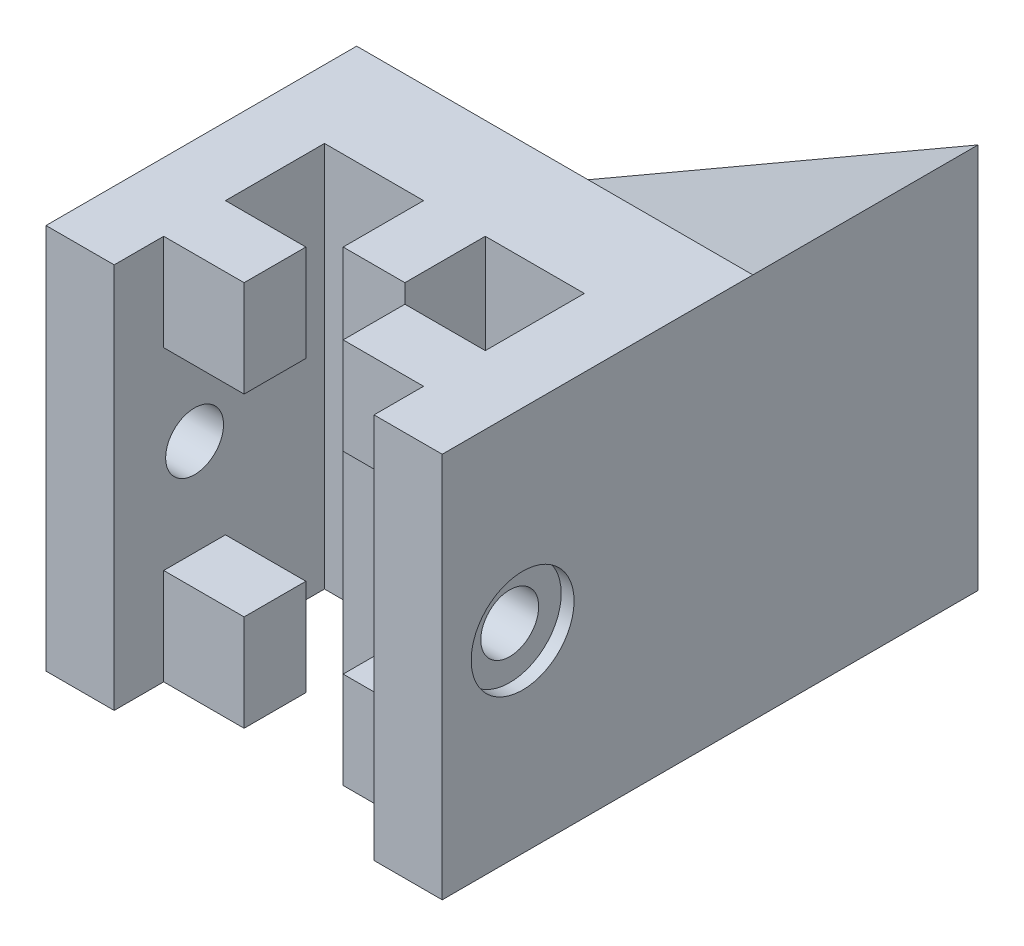
ISO-10303-21;
HEADER;
FILE_DESCRIPTION(('STEP AP214'),'2;1');
FILE_NAME('part.step','',(''),(''),'','','');
FILE_SCHEMA(('AUTOMOTIVE_DESIGN { 1 0 10303 214 1 1 1 1 }'));
ENDSEC;
DATA;
#1=APPLICATION_CONTEXT('core data for automotive mechanical design processes');
#2=APPLICATION_PROTOCOL_DEFINITION('international standard','automotive_design',2000,#1);
#3=PRODUCT_CONTEXT('',#1,'mechanical');
#4=PRODUCT('Part','Part','',(#3));
#5=PRODUCT_RELATED_PRODUCT_CATEGORY('part','',(#4));
#6=PRODUCT_DEFINITION_FORMATION('','',#4);
#7=PRODUCT_DEFINITION_CONTEXT('part definition',#1,'design');
#8=PRODUCT_DEFINITION('design','',#6,#7);
#9=PRODUCT_DEFINITION_SHAPE('','',#8);
#10=(LENGTH_UNIT() NAMED_UNIT(*) SI_UNIT(.MILLI.,.METRE.));
#11=(NAMED_UNIT(*) PLANE_ANGLE_UNIT() SI_UNIT($,.RADIAN.));
#12=(NAMED_UNIT(*) SI_UNIT($,.STERADIAN.) SOLID_ANGLE_UNIT());
#13=UNCERTAINTY_MEASURE_WITH_UNIT(LENGTH_MEASURE(1.E-05),#10,'distance_accuracy_value','');
#14=(GEOMETRIC_REPRESENTATION_CONTEXT(3) GLOBAL_UNCERTAINTY_ASSIGNED_CONTEXT((#13)) GLOBAL_UNIT_ASSIGNED_CONTEXT((#10,
#11,#12)) REPRESENTATION_CONTEXT('',''));
#15=CARTESIAN_POINT('',(0.,0.,0.));
#16=DIRECTION('',(0.,0.,1.));
#17=DIRECTION('',(1.,0.,0.));
#18=AXIS2_PLACEMENT_3D('',#15,#16,#17);
#19=CARTESIAN_POINT('',(-3.85,15.,2.4));
#20=DIRECTION('',(0.,0.,-1.));
#21=DIRECTION('',(-1.,0.,0.));
#22=AXIS2_PLACEMENT_3D('',#19,#20,#21);
#23=PLANE('',#22);
#24=DIRECTION('',(0.,-1.,0.));
#25=VECTOR('',#24,1.);
#26=CARTESIAN_POINT('',(-10.1,15.,2.4));
#27=LINE('',#26,#25);
#28=CARTESIAN_POINT('',(-10.1,15.,2.4));
#29=VERTEX_POINT('',#28);
#30=CARTESIAN_POINT('',(-10.1,7.5,2.4));
#31=VERTEX_POINT('',#30);
#32=EDGE_CURVE('E253',#29,#31,#27,.T.);
#33=ORIENTED_EDGE('',*,*,#32,.T.);
#34=DIRECTION('',(1.,0.,0.));
#35=VECTOR('',#34,1.);
#36=CARTESIAN_POINT('',(-10.1,7.5,2.4));
#37=LINE('',#36,#35);
#38=CARTESIAN_POINT('',(-3.85,7.5,2.4));
#39=VERTEX_POINT('',#38);
#40=EDGE_CURVE('E455',#31,#39,#37,.T.);
#41=ORIENTED_EDGE('',*,*,#40,.T.);
#42=DIRECTION('',(0.,-1.,0.));
#43=VECTOR('',#42,1.);
#44=CARTESIAN_POINT('',(-3.85,15.,2.4));
#45=LINE('',#44,#43);
#46=CARTESIAN_POINT('',(-3.85,15.,2.4));
#47=VERTEX_POINT('',#46);
#48=EDGE_CURVE('E11',#47,#39,#45,.T.);
#49=ORIENTED_EDGE('',*,*,#48,.F.);
#50=DIRECTION('',(1.,0.,0.));
#51=VECTOR('',#50,1.);
#52=CARTESIAN_POINT('',(-3.85,15.,2.4));
#53=LINE('',#52,#51);
#54=EDGE_CURVE('E371',#29,#47,#53,.T.);
#55=ORIENTED_EDGE('',*,*,#54,.F.);
#56=EDGE_LOOP('',(#33,#41,#49,#55));
#57=FACE_BOUND('',#56,.T.);
#58=ADVANCED_FACE('F37',(#57),#23,.F.);
#59=CARTESIAN_POINT('',(-3.85,15.,2.4));
#60=DIRECTION('',(-1.,0.,0.));
#61=DIRECTION('',(0.,0.,1.));
#62=AXIS2_PLACEMENT_3D('',#59,#60,#61);
#63=PLANE('',#62);
#64=ORIENTED_EDGE('',*,*,#48,.T.);
#65=DIRECTION('',(0.,0.,1.));
#66=VECTOR('',#65,1.);
#67=CARTESIAN_POINT('',(-3.85,7.5,2.4));
#68=LINE('',#67,#66);
#69=CARTESIAN_POINT('',(-3.85,7.5,-2.4));
#70=VERTEX_POINT('',#69);
#71=EDGE_CURVE('E240',#70,#39,#68,.T.);
#72=ORIENTED_EDGE('',*,*,#71,.F.);
#73=DIRECTION('',(0.,-1.,0.));
#74=VECTOR('',#73,1.);
#75=CARTESIAN_POINT('',(-3.85,15.,-2.4));
#76=LINE('',#75,#74);
#77=CARTESIAN_POINT('',(-3.85,15.,-2.4));
#78=VERTEX_POINT('',#77);
#79=EDGE_CURVE('E310',#78,#70,#76,.T.);
#80=ORIENTED_EDGE('',*,*,#79,.F.);
#81=DIRECTION('',(0.,0.,-1.));
#82=VECTOR('',#81,1.);
#83=CARTESIAN_POINT('',(-3.85,15.,2.4));
#84=LINE('',#83,#82);
#85=EDGE_CURVE('E373',#47,#78,#84,.T.);
#86=ORIENTED_EDGE('',*,*,#85,.F.);
#87=EDGE_LOOP('',(#64,#72,#80,#86));
#88=FACE_BOUND('',#87,.T.);
#89=ADVANCED_FACE('F535',(#88),#63,.F.);
#90=CARTESIAN_POINT('',(-3.85,15.,-2.4));
#91=DIRECTION('',(0.,0.,1.));
#92=DIRECTION('',(1.,0.,0.));
#93=AXIS2_PLACEMENT_3D('',#90,#91,#92);
#94=PLANE('',#93);
#95=ORIENTED_EDGE('',*,*,#79,.T.);
#96=DIRECTION('',(1.,0.,0.));
#97=VECTOR('',#96,1.);
#98=CARTESIAN_POINT('',(-10.1,7.5,-2.4));
#99=LINE('',#98,#97);
#100=CARTESIAN_POINT('',(-10.1,7.5,-2.4));
#101=VERTEX_POINT('',#100);
#102=EDGE_CURVE('E460',#101,#70,#99,.T.);
#103=ORIENTED_EDGE('',*,*,#102,.F.);
#104=DIRECTION('',(0.,-1.,0.));
#105=VECTOR('',#104,1.);
#106=CARTESIAN_POINT('',(-10.1,15.,-2.4));
#107=LINE('',#106,#105);
#108=CARTESIAN_POINT('',(-10.1,15.,-2.4));
#109=VERTEX_POINT('',#108);
#110=EDGE_CURVE('E308',#109,#101,#107,.T.);
#111=ORIENTED_EDGE('',*,*,#110,.F.);
#112=DIRECTION('',(-1.,0.,0.));
#113=VECTOR('',#112,1.);
#114=CARTESIAN_POINT('',(-3.85,15.,-2.4));
#115=LINE('',#114,#113);
#116=EDGE_CURVE('E378',#78,#109,#115,.T.);
#117=ORIENTED_EDGE('',*,*,#116,.F.);
#118=EDGE_LOOP('',(#95,#103,#111,#117));
#119=FACE_BOUND('',#118,.T.);
#120=ADVANCED_FACE('F541',(#119),#94,.F.);
#121=CARTESIAN_POINT('',(3.85,15.,-2.4));
#122=DIRECTION('',(0.,0.,1.));
#123=DIRECTION('',(1.,0.,0.));
#124=AXIS2_PLACEMENT_3D('',#121,#122,#123);
#125=PLANE('',#124);
#126=DIRECTION('',(0.,-1.,0.));
#127=VECTOR('',#126,1.);
#128=CARTESIAN_POINT('',(10.1,15.,-2.4));
#129=LINE('',#128,#127);
#130=CARTESIAN_POINT('',(10.1,15.,-2.4));
#131=VERTEX_POINT('',#130);
#132=CARTESIAN_POINT('',(10.1,7.5,-2.4));
#133=VERTEX_POINT('',#132);
#134=EDGE_CURVE('E286',#131,#133,#129,.T.);
#135=ORIENTED_EDGE('',*,*,#134,.T.);
#136=DIRECTION('',(-1.,0.,0.));
#137=VECTOR('',#136,1.);
#138=CARTESIAN_POINT('',(10.1,7.5,-2.4));
#139=LINE('',#138,#137);
#140=CARTESIAN_POINT('',(3.85,7.5,-2.4));
#141=VERTEX_POINT('',#140);
#142=EDGE_CURVE('E431',#133,#141,#139,.T.);
#143=ORIENTED_EDGE('',*,*,#142,.T.);
#144=DIRECTION('',(0.,-1.,0.));
#145=VECTOR('',#144,1.);
#146=CARTESIAN_POINT('',(3.85,15.,-2.4));
#147=LINE('',#146,#145);
#148=CARTESIAN_POINT('',(3.85,15.,-2.4));
#149=VERTEX_POINT('',#148);
#150=EDGE_CURVE('E282',#149,#141,#147,.T.);
#151=ORIENTED_EDGE('',*,*,#150,.F.);
#152=DIRECTION('',(-1.,0.,0.));
#153=VECTOR('',#152,1.);
#154=CARTESIAN_POINT('',(3.85,15.,-2.4));
#155=LINE('',#154,#153);
#156=EDGE_CURVE('E399',#131,#149,#155,.T.);
#157=ORIENTED_EDGE('',*,*,#156,.F.);
#158=EDGE_LOOP('',(#135,#143,#151,#157));
#159=FACE_BOUND('',#158,.T.);
#160=ADVANCED_FACE('F578',(#159),#125,.F.);
#161=CARTESIAN_POINT('',(3.85,15.,2.4));
#162=DIRECTION('',(1.,0.,0.));
#163=DIRECTION('',(0.,0.,-1.));
#164=AXIS2_PLACEMENT_3D('',#161,#162,#163);
#165=PLANE('',#164);
#166=ORIENTED_EDGE('',*,*,#150,.T.);
#167=DIRECTION('',(0.,0.,-1.));
#168=VECTOR('',#167,1.);
#169=CARTESIAN_POINT('',(3.85,7.5,-2.4));
#170=LINE('',#169,#168);
#171=CARTESIAN_POINT('',(3.85,7.5,2.4));
#172=VERTEX_POINT('',#171);
#173=EDGE_CURVE('E451',#172,#141,#170,.T.);
#174=ORIENTED_EDGE('',*,*,#173,.F.);
#175=DIRECTION('',(0.,-1.,0.));
#176=VECTOR('',#175,1.);
#177=CARTESIAN_POINT('',(3.85,15.,2.4));
#178=LINE('',#177,#176);
#179=CARTESIAN_POINT('',(3.85,15.,2.4));
#180=VERTEX_POINT('',#179);
#181=EDGE_CURVE('E278',#180,#172,#178,.T.);
#182=ORIENTED_EDGE('',*,*,#181,.F.);
#183=DIRECTION('',(0.,0.,1.));
#184=VECTOR('',#183,1.);
#185=CARTESIAN_POINT('',(3.85,15.,2.4));
#186=LINE('',#185,#184);
#187=EDGE_CURVE('E401',#149,#180,#186,.T.);
#188=ORIENTED_EDGE('',*,*,#187,.F.);
#189=EDGE_LOOP('',(#166,#174,#182,#188));
#190=FACE_BOUND('',#189,.T.);
#191=ADVANCED_FACE('F583',(#190),#165,.F.);
#192=CARTESIAN_POINT('',(3.85,15.,2.4));
#193=DIRECTION('',(0.,0.,-1.));
#194=DIRECTION('',(-1.,0.,0.));
#195=AXIS2_PLACEMENT_3D('',#192,#193,#194);
#196=PLANE('',#195);
#197=ORIENTED_EDGE('',*,*,#181,.T.);
#198=DIRECTION('',(-1.,0.,0.));
#199=VECTOR('',#198,1.);
#200=CARTESIAN_POINT('',(10.1,7.5,2.4));
#201=LINE('',#200,#199);
#202=CARTESIAN_POINT('',(10.1,7.5,2.4));
#203=VERTEX_POINT('',#202);
#204=EDGE_CURVE('E447',#203,#172,#201,.T.);
#205=ORIENTED_EDGE('',*,*,#204,.F.);
#206=DIRECTION('',(0.,-1.,0.));
#207=VECTOR('',#206,1.);
#208=CARTESIAN_POINT('',(10.1,15.,2.4));
#209=LINE('',#208,#207);
#210=CARTESIAN_POINT('',(10.1,15.,2.4));
#211=VERTEX_POINT('',#210);
#212=EDGE_CURVE('E274',#211,#203,#209,.T.);
#213=ORIENTED_EDGE('',*,*,#212,.F.);
#214=DIRECTION('',(1.,0.,0.));
#215=VECTOR('',#214,1.);
#216=CARTESIAN_POINT('',(3.85,15.,2.4));
#217=LINE('',#216,#215);
#218=EDGE_CURVE('E403',#180,#211,#217,.T.);
#219=ORIENTED_EDGE('',*,*,#218,.F.);
#220=EDGE_LOOP('',(#197,#205,#213,#219));
#221=FACE_BOUND('',#220,.T.);
#222=ADVANCED_FACE('F498',(#221),#196,.F.);
#223=CARTESIAN_POINT('',(-15.4,15.,-15.4));
#224=DIRECTION('',(1.,0.,0.));
#225=DIRECTION('',(0.,0.,-1.));
#226=AXIS2_PLACEMENT_3D('',#223,#224,#225);
#227=PLANE('',#226);
#228=CARTESIAN_POINT('',(-15.4,0.,0.));
#229=DIRECTION('',(-1.,0.,0.));
#230=DIRECTION('',(0.,0.,1.));
#231=AXIS2_PLACEMENT_3D('',#228,#229,#230);
#232=CIRCLE('',#231,3.99999999999999);
#233=CARTESIAN_POINT('',(-15.4,0.,3.99999999999999));
#234=VERTEX_POINT('',#233);
#235=EDGE_CURVE('E489',#234,#234,#232,.T.);
#236=ORIENTED_EDGE('',*,*,#235,.F.);
#237=EDGE_LOOP('',(#236));
#238=FACE_BOUND('',#237,.T.);
#239=DIRECTION('',(0.,0.,1.));
#240=VECTOR('',#239,1.);
#241=CARTESIAN_POINT('',(-15.4,-2.78238829104051,-157.476492008178));
#242=LINE('',#241,#240);
#243=CARTESIAN_POINT('',(-15.4,-2.78238829104051,-35.4));
#244=VERTEX_POINT('',#243);
#245=CARTESIAN_POINT('',(-15.4,-2.78238829104051,-17.9));
#246=VERTEX_POINT('',#245);
#247=EDGE_CURVE('E434',#244,#246,#242,.T.);
#248=ORIENTED_EDGE('',*,*,#247,.F.);
#249=DIRECTION('',(0.,1.,0.));
#250=VECTOR('',#249,1.);
#251=CARTESIAN_POINT('',(-15.4,15.,-35.4));
#252=LINE('',#251,#250);
#253=CARTESIAN_POINT('',(-15.4,-15.,-35.4));
#254=VERTEX_POINT('',#253);
#255=EDGE_CURVE('E381',#254,#244,#252,.T.);
#256=ORIENTED_EDGE('',*,*,#255,.F.);
#257=DIRECTION('',(0.,0.,1.));
#258=VECTOR('',#257,1.);
#259=CARTESIAN_POINT('',(-15.4,-15.,-15.4));
#260=LINE('',#259,#258);
#261=CARTESIAN_POINT('',(-15.4,-15.,6.25));
#262=VERTEX_POINT('',#261);
#263=EDGE_CURVE('E366',#254,#262,#260,.T.);
#264=ORIENTED_EDGE('',*,*,#263,.T.);
#265=DIRECTION('',(0.,-1.,0.));
#266=VECTOR('',#265,1.);
#267=CARTESIAN_POINT('',(-15.4,15.,6.25));
#268=LINE('',#267,#266);
#269=CARTESIAN_POINT('',(-15.4,15.,6.25));
#270=VERTEX_POINT('',#269);
#271=EDGE_CURVE('E264',#270,#262,#268,.T.);
#272=ORIENTED_EDGE('',*,*,#271,.F.);
#273=DIRECTION('',(0.,0.,1.));
#274=VECTOR('',#273,1.);
#275=CARTESIAN_POINT('',(-15.4,15.,-15.4));
#276=LINE('',#275,#274);
#277=CARTESIAN_POINT('',(-15.4,15.,-17.9));
#278=VERTEX_POINT('',#277);
#279=EDGE_CURVE('E412',#278,#270,#276,.T.);
#280=ORIENTED_EDGE('',*,*,#279,.F.);
#281=DIRECTION('',(0.,1.,0.));
#282=VECTOR('',#281,1.);
#283=CARTESIAN_POINT('',(-15.4,15.,-17.9));
#284=LINE('',#283,#282);
#285=EDGE_CURVE('E429',#246,#278,#284,.T.);
#286=ORIENTED_EDGE('',*,*,#285,.F.);
#287=EDGE_LOOP('',(#248,#256,#264,#272,#280,#286));
#288=FACE_BOUND('',#287,.T.);
#289=ADVANCED_FACE('F495',(#238,#288),#227,.F.);
#290=CARTESIAN_POINT('',(-3.85,-7.5,2.4));
#291=VERTEX_POINT('',#290);
#292=CARTESIAN_POINT('',(-3.85,-15.,2.4));
#293=VERTEX_POINT('',#292);
#294=EDGE_CURVE('E45',#291,#293,#45,.T.);
#295=ORIENTED_EDGE('',*,*,#294,.F.);
#296=DIRECTION('',(1.,0.,0.));
#297=VECTOR('',#296,1.);
#298=CARTESIAN_POINT('',(-10.1,-7.5,2.4));
#299=LINE('',#298,#297);
#300=CARTESIAN_POINT('',(-10.1,-7.5,2.4));
#301=VERTEX_POINT('',#300);
#302=EDGE_CURVE('E234',#301,#291,#299,.T.);
#303=ORIENTED_EDGE('',*,*,#302,.F.);
#304=CARTESIAN_POINT('',(-10.1,-15.,2.4));
#305=VERTEX_POINT('',#304);
#306=EDGE_CURVE('E245',#301,#305,#27,.T.);
#307=ORIENTED_EDGE('',*,*,#306,.T.);
#308=DIRECTION('',(1.,0.,0.));
#309=VECTOR('',#308,1.);
#310=CARTESIAN_POINT('',(-3.85,-15.,2.4));
#311=LINE('',#310,#309);
#312=EDGE_CURVE('E329',#305,#293,#311,.T.);
#313=ORIENTED_EDGE('',*,*,#312,.T.);
#314=EDGE_LOOP('',(#295,#303,#307,#313));
#315=FACE_BOUND('',#314,.T.);
#316=ADVANCED_FACE('F39',(#315),#23,.F.);
#317=CARTESIAN_POINT('',(-3.85,-7.5,-2.4));
#318=VERTEX_POINT('',#317);
#319=CARTESIAN_POINT('',(-3.85,-15.,-2.4));
#320=VERTEX_POINT('',#319);
#321=EDGE_CURVE('E309',#318,#320,#76,.T.);
#322=ORIENTED_EDGE('',*,*,#321,.F.);
#323=DIRECTION('',(0.,0.,-1.));
#324=VECTOR('',#323,1.);
#325=CARTESIAN_POINT('',(-3.85,-7.5,2.4));
#326=LINE('',#325,#324);
#327=EDGE_CURVE('E465',#291,#318,#326,.T.);
#328=ORIENTED_EDGE('',*,*,#327,.F.);
#329=ORIENTED_EDGE('',*,*,#294,.T.);
#330=DIRECTION('',(0.,0.,-1.));
#331=VECTOR('',#330,1.);
#332=CARTESIAN_POINT('',(-3.85,-15.,2.4));
#333=LINE('',#332,#331);
#334=EDGE_CURVE('E326',#293,#320,#333,.T.);
#335=ORIENTED_EDGE('',*,*,#334,.T.);
#336=EDGE_LOOP('',(#322,#328,#329,#335));
#337=FACE_BOUND('',#336,.T.);
#338=ADVANCED_FACE('F327',(#337),#63,.F.);
#339=CARTESIAN_POINT('',(-10.1,-7.5,-2.4));
#340=VERTEX_POINT('',#339);
#341=CARTESIAN_POINT('',(-10.1,-15.,-2.4));
#342=VERTEX_POINT('',#341);
#343=EDGE_CURVE('E307',#340,#342,#107,.T.);
#344=ORIENTED_EDGE('',*,*,#343,.F.);
#345=DIRECTION('',(1.,0.,0.));
#346=VECTOR('',#345,1.);
#347=CARTESIAN_POINT('',(-10.1,-7.5,-2.4));
#348=LINE('',#347,#346);
#349=EDGE_CURVE('E237',#340,#318,#348,.T.);
#350=ORIENTED_EDGE('',*,*,#349,.T.);
#351=ORIENTED_EDGE('',*,*,#321,.T.);
#352=DIRECTION('',(-1.,0.,0.));
#353=VECTOR('',#352,1.);
#354=CARTESIAN_POINT('',(-3.85,-15.,-2.4));
#355=LINE('',#354,#353);
#356=EDGE_CURVE('E322',#320,#342,#355,.T.);
#357=ORIENTED_EDGE('',*,*,#356,.T.);
#358=EDGE_LOOP('',(#344,#350,#351,#357));
#359=FACE_BOUND('',#358,.T.);
#360=ADVANCED_FACE('F320',(#359),#94,.F.);
#361=CARTESIAN_POINT('',(-10.1,15.,-10.1));
#362=DIRECTION('',(0.,0.,-1.));
#363=DIRECTION('',(-1.,0.,0.));
#364=AXIS2_PLACEMENT_3D('',#361,#362,#363);
#365=PLANE('',#364);
#366=DIRECTION('',(1.,0.,0.));
#367=VECTOR('',#366,1.);
#368=CARTESIAN_POINT('',(-10.1,-15.,-10.1));
#369=LINE('',#368,#367);
#370=CARTESIAN_POINT('',(-10.1,-15.,-10.1));
#371=VERTEX_POINT('',#370);
#372=CARTESIAN_POINT('',(-2.4,-15.,-10.1));
#373=VERTEX_POINT('',#372);
#374=EDGE_CURVE('E335',#371,#373,#369,.T.);
#375=ORIENTED_EDGE('',*,*,#374,.T.);
#376=DIRECTION('',(0.,-1.,0.));
#377=VECTOR('',#376,1.);
#378=CARTESIAN_POINT('',(-2.4,15.,-10.1));
#379=LINE('',#378,#377);
#380=CARTESIAN_POINT('',(-2.4,15.,-10.1));
#381=VERTEX_POINT('',#380);
#382=EDGE_CURVE('E301',#381,#373,#379,.T.);
#383=ORIENTED_EDGE('',*,*,#382,.F.);
#384=DIRECTION('',(1.,0.,0.));
#385=VECTOR('',#384,1.);
#386=CARTESIAN_POINT('',(-10.1,15.,-10.1));
#387=LINE('',#386,#385);
#388=CARTESIAN_POINT('',(-10.1,15.,-10.1));
#389=VERTEX_POINT('',#388);
#390=EDGE_CURVE('E387',#389,#381,#387,.T.);
#391=ORIENTED_EDGE('',*,*,#390,.F.);
#392=DIRECTION('',(0.,-1.,0.));
#393=VECTOR('',#392,1.);
#394=CARTESIAN_POINT('',(-10.1,15.,-10.1));
#395=LINE('',#394,#393);
#396=EDGE_CURVE('E304',#389,#371,#395,.T.);
#397=ORIENTED_EDGE('',*,*,#396,.T.);
#398=EDGE_LOOP('',(#375,#383,#391,#397));
#399=FACE_BOUND('',#398,.T.);
#400=ADVANCED_FACE('F551',(#399),#365,.F.);
#401=CARTESIAN_POINT('',(-2.4,15.,-10.1));
#402=DIRECTION('',(1.,0.,0.));
#403=DIRECTION('',(0.,0.,-1.));
#404=AXIS2_PLACEMENT_3D('',#401,#402,#403);
#405=PLANE('',#404);
#406=DIRECTION('',(0.,0.,1.));
#407=VECTOR('',#406,1.);
#408=CARTESIAN_POINT('',(-2.4,-15.,-10.1));
#409=LINE('',#408,#407);
#410=CARTESIAN_POINT('',(-2.4,-15.,-3.85));
#411=VERTEX_POINT('',#410);
#412=EDGE_CURVE('E340',#373,#411,#409,.T.);
#413=ORIENTED_EDGE('',*,*,#412,.T.);
#414=DIRECTION('',(0.,-1.,0.));
#415=VECTOR('',#414,1.);
#416=CARTESIAN_POINT('',(-2.4,15.,-3.85));
#417=LINE('',#416,#415);
#418=CARTESIAN_POINT('',(-2.4,15.,-3.85));
#419=VERTEX_POINT('',#418);
#420=EDGE_CURVE('E298',#419,#411,#417,.T.);
#421=ORIENTED_EDGE('',*,*,#420,.F.);
#422=DIRECTION('',(0.,0.,1.));
#423=VECTOR('',#422,1.);
#424=CARTESIAN_POINT('',(-2.4,15.,-10.1));
#425=LINE('',#424,#423);
#426=EDGE_CURVE('E389',#381,#419,#425,.T.);
#427=ORIENTED_EDGE('',*,*,#426,.F.);
#428=ORIENTED_EDGE('',*,*,#382,.T.);
#429=EDGE_LOOP('',(#413,#421,#427,#428));
#430=FACE_BOUND('',#429,.T.);
#431=ADVANCED_FACE('F556',(#430),#405,.F.);
#432=CARTESIAN_POINT('',(-2.4,15.,-3.85));
#433=DIRECTION('',(0.,0.,-1.));
#434=DIRECTION('',(-1.,0.,0.));
#435=AXIS2_PLACEMENT_3D('',#432,#433,#434);
#436=PLANE('',#435);
#437=DIRECTION('',(1.,0.,0.));
#438=VECTOR('',#437,1.);
#439=CARTESIAN_POINT('',(-2.4,-15.,-3.85));
#440=LINE('',#439,#438);
#441=CARTESIAN_POINT('',(2.4,-15.,-3.85));
#442=VERTEX_POINT('',#441);
#443=EDGE_CURVE('E342',#411,#442,#440,.T.);
#444=ORIENTED_EDGE('',*,*,#443,.T.);
#445=DIRECTION('',(0.,-1.,0.));
#446=VECTOR('',#445,1.);
#447=CARTESIAN_POINT('',(2.4,15.,-3.85));
#448=LINE('',#447,#446);
#449=CARTESIAN_POINT('',(2.4,15.,-3.85));
#450=VERTEX_POINT('',#449);
#451=EDGE_CURVE('E295',#450,#442,#448,.T.);
#452=ORIENTED_EDGE('',*,*,#451,.F.);
#453=DIRECTION('',(1.,0.,0.));
#454=VECTOR('',#453,1.);
#455=CARTESIAN_POINT('',(-2.4,15.,-3.85));
#456=LINE('',#455,#454);
#457=EDGE_CURVE('E391',#419,#450,#456,.T.);
#458=ORIENTED_EDGE('',*,*,#457,.F.);
#459=ORIENTED_EDGE('',*,*,#420,.T.);
#460=EDGE_LOOP('',(#444,#452,#458,#459));
#461=FACE_BOUND('',#460,.T.);
#462=ADVANCED_FACE('F560',(#461),#436,.F.);
#463=CARTESIAN_POINT('',(2.4,15.,-10.1));
#464=DIRECTION('',(-1.,0.,0.));
#465=DIRECTION('',(0.,0.,1.));
#466=AXIS2_PLACEMENT_3D('',#463,#464,#465);
#467=PLANE('',#466);
#468=DIRECTION('',(0.,0.,-1.));
#469=VECTOR('',#468,1.);
#470=CARTESIAN_POINT('',(2.4,-15.,-10.1));
#471=LINE('',#470,#469);
#472=CARTESIAN_POINT('',(2.4,-15.,-10.1));
#473=VERTEX_POINT('',#472);
#474=EDGE_CURVE('E344',#442,#473,#471,.T.);
#475=ORIENTED_EDGE('',*,*,#474,.T.);
#476=DIRECTION('',(0.,-1.,0.));
#477=VECTOR('',#476,1.);
#478=CARTESIAN_POINT('',(2.4,15.,-10.1));
#479=LINE('',#478,#477);
#480=CARTESIAN_POINT('',(2.4,15.,-10.1));
#481=VERTEX_POINT('',#480);
#482=EDGE_CURVE('E292',#481,#473,#479,.T.);
#483=ORIENTED_EDGE('',*,*,#482,.F.);
#484=DIRECTION('',(0.,0.,-1.));
#485=VECTOR('',#484,1.);
#486=CARTESIAN_POINT('',(2.4,15.,-10.1));
#487=LINE('',#486,#485);
#488=EDGE_CURVE('E393',#450,#481,#487,.T.);
#489=ORIENTED_EDGE('',*,*,#488,.F.);
#490=ORIENTED_EDGE('',*,*,#451,.T.);
#491=EDGE_LOOP('',(#475,#483,#489,#490));
#492=FACE_BOUND('',#491,.T.);
#493=ADVANCED_FACE('F564',(#492),#467,.F.);
#494=CARTESIAN_POINT('',(10.1,15.,-10.1));
#495=DIRECTION('',(0.,0.,-1.));
#496=DIRECTION('',(-1.,0.,0.));
#497=AXIS2_PLACEMENT_3D('',#494,#495,#496);
#498=PLANE('',#497);
#499=DIRECTION('',(1.,0.,0.));
#500=VECTOR('',#499,1.);
#501=CARTESIAN_POINT('',(10.1,-15.,-10.1));
#502=LINE('',#501,#500);
#503=CARTESIAN_POINT('',(10.1,-15.,-10.1));
#504=VERTEX_POINT('',#503);
#505=EDGE_CURVE('E346',#473,#504,#502,.T.);
#506=ORIENTED_EDGE('',*,*,#505,.T.);
#507=DIRECTION('',(0.,-1.,0.));
#508=VECTOR('',#507,1.);
#509=CARTESIAN_POINT('',(10.1,15.,-10.1));
#510=LINE('',#509,#508);
#511=CARTESIAN_POINT('',(10.1,15.,-10.1));
#512=VERTEX_POINT('',#511);
#513=EDGE_CURVE('E289',#512,#504,#510,.T.);
#514=ORIENTED_EDGE('',*,*,#513,.F.);
#515=DIRECTION('',(1.,0.,0.));
#516=VECTOR('',#515,1.);
#517=CARTESIAN_POINT('',(10.1,15.,-10.1));
#518=LINE('',#517,#516);
#519=EDGE_CURVE('E395',#481,#512,#518,.T.);
#520=ORIENTED_EDGE('',*,*,#519,.F.);
#521=ORIENTED_EDGE('',*,*,#482,.T.);
#522=EDGE_LOOP('',(#506,#514,#520,#521));
#523=FACE_BOUND('',#522,.T.);
#524=ADVANCED_FACE('F568',(#523),#498,.F.);
#525=CARTESIAN_POINT('',(3.85,-7.5,-2.4));
#526=VERTEX_POINT('',#525);
#527=CARTESIAN_POINT('',(3.85,-15.,-2.4));
#528=VERTEX_POINT('',#527);
#529=EDGE_CURVE('E281',#526,#528,#147,.T.);
#530=ORIENTED_EDGE('',*,*,#529,.F.);
#531=DIRECTION('',(-1.,0.,0.));
#532=VECTOR('',#531,1.);
#533=CARTESIAN_POINT('',(10.1,-7.5,-2.4));
#534=LINE('',#533,#532);
#535=CARTESIAN_POINT('',(10.1,-7.5,-2.4));
#536=VERTEX_POINT('',#535);
#537=EDGE_CURVE('E441',#536,#526,#534,.T.);
#538=ORIENTED_EDGE('',*,*,#537,.F.);
#539=CARTESIAN_POINT('',(10.1,-15.,-2.4));
#540=VERTEX_POINT('',#539);
#541=EDGE_CURVE('E285',#536,#540,#129,.T.);
#542=ORIENTED_EDGE('',*,*,#541,.T.);
#543=DIRECTION('',(-1.,0.,0.));
#544=VECTOR('',#543,1.);
#545=CARTESIAN_POINT('',(3.85,-15.,-2.4));
#546=LINE('',#545,#544);
#547=EDGE_CURVE('E351',#540,#528,#546,.T.);
#548=ORIENTED_EDGE('',*,*,#547,.T.);
#549=EDGE_LOOP('',(#530,#538,#542,#548));
#550=FACE_BOUND('',#549,.T.);
#551=ADVANCED_FACE('F572',(#550),#125,.F.);
#552=CARTESIAN_POINT('',(3.85,-7.5,2.4));
#553=VERTEX_POINT('',#552);
#554=CARTESIAN_POINT('',(3.85,-15.,2.4));
#555=VERTEX_POINT('',#554);
#556=EDGE_CURVE('E277',#553,#555,#178,.T.);
#557=ORIENTED_EDGE('',*,*,#556,.F.);
#558=DIRECTION('',(0.,0.,1.));
#559=VECTOR('',#558,1.);
#560=CARTESIAN_POINT('',(3.85,-7.5,-2.4));
#561=LINE('',#560,#559);
#562=EDGE_CURVE('E453',#526,#553,#561,.T.);
#563=ORIENTED_EDGE('',*,*,#562,.F.);
#564=ORIENTED_EDGE('',*,*,#529,.T.);
#565=DIRECTION('',(0.,0.,1.));
#566=VECTOR('',#565,1.);
#567=CARTESIAN_POINT('',(3.85,-15.,2.4));
#568=LINE('',#567,#566);
#569=EDGE_CURVE('E354',#528,#555,#568,.T.);
#570=ORIENTED_EDGE('',*,*,#569,.T.);
#571=EDGE_LOOP('',(#557,#563,#564,#570));
#572=FACE_BOUND('',#571,.T.);
#573=ADVANCED_FACE('F576',(#572),#165,.F.);
#574=CARTESIAN_POINT('',(10.1,-7.5,2.4));
#575=VERTEX_POINT('',#574);
#576=CARTESIAN_POINT('',(10.1,-15.,2.4));
#577=VERTEX_POINT('',#576);
#578=EDGE_CURVE('E273',#575,#577,#209,.T.);
#579=ORIENTED_EDGE('',*,*,#578,.F.);
#580=DIRECTION('',(-1.,0.,0.));
#581=VECTOR('',#580,1.);
#582=CARTESIAN_POINT('',(10.1,-7.5,2.4));
#583=LINE('',#582,#581);
#584=EDGE_CURVE('E443',#575,#553,#583,.T.);
#585=ORIENTED_EDGE('',*,*,#584,.T.);
#586=ORIENTED_EDGE('',*,*,#556,.T.);
#587=DIRECTION('',(1.,0.,0.));
#588=VECTOR('',#587,1.);
#589=CARTESIAN_POINT('',(3.85,-15.,2.4));
#590=LINE('',#589,#588);
#591=EDGE_CURVE('E357',#555,#577,#590,.T.);
#592=ORIENTED_EDGE('',*,*,#591,.T.);
#593=EDGE_LOOP('',(#579,#585,#586,#592));
#594=FACE_BOUND('',#593,.T.);
#595=ADVANCED_FACE('F581',(#594),#196,.F.);
#596=CARTESIAN_POINT('',(10.1,15.,2.4));
#597=DIRECTION('',(1.,0.,0.));
#598=DIRECTION('',(0.,0.,-1.));
#599=AXIS2_PLACEMENT_3D('',#596,#597,#598);
#600=PLANE('',#599);
#601=CARTESIAN_POINT('',(10.1,0.,0.));
#602=DIRECTION('',(1.,0.,0.));
#603=DIRECTION('',(0.,0.,-1.));
#604=AXIS2_PLACEMENT_3D('',#601,#602,#603);
#605=CIRCLE('',#604,2.25);
#606=CARTESIAN_POINT('',(10.1,0.,-2.25));
#607=VERTEX_POINT('',#606);
#608=EDGE_CURVE('E467',#607,#607,#605,.T.);
#609=ORIENTED_EDGE('',*,*,#608,.T.);
#610=EDGE_LOOP('',(#609));
#611=FACE_BOUND('',#610,.T.);
#612=DIRECTION('',(0.,0.,1.));
#613=VECTOR('',#612,1.);
#614=CARTESIAN_POINT('',(10.1,-15.,2.4));
#615=LINE('',#614,#613);
#616=CARTESIAN_POINT('',(10.1,-15.,6.25));
#617=VERTEX_POINT('',#616);
#618=EDGE_CURVE('E360',#577,#617,#615,.T.);
#619=ORIENTED_EDGE('',*,*,#618,.T.);
#620=DIRECTION('',(0.,-1.,0.));
#621=VECTOR('',#620,1.);
#622=CARTESIAN_POINT('',(10.1,15.,6.25));
#623=LINE('',#622,#621);
#624=CARTESIAN_POINT('',(10.1,15.,6.25));
#625=VERTEX_POINT('',#624);
#626=EDGE_CURVE('E270',#625,#617,#623,.T.);
#627=ORIENTED_EDGE('',*,*,#626,.F.);
#628=DIRECTION('',(0.,0.,1.));
#629=VECTOR('',#628,1.);
#630=CARTESIAN_POINT('',(10.1,15.,2.4));
#631=LINE('',#630,#629);
#632=EDGE_CURVE('E405',#211,#625,#631,.T.);
#633=ORIENTED_EDGE('',*,*,#632,.F.);
#634=ORIENTED_EDGE('',*,*,#212,.T.);
#635=DIRECTION('',(0.,0.,-1.));
#636=VECTOR('',#635,1.);
#637=CARTESIAN_POINT('',(10.1,7.5,-2.4));
#638=LINE('',#637,#636);
#639=EDGE_CURVE('E444',#203,#133,#638,.T.);
#640=ORIENTED_EDGE('',*,*,#639,.T.);
#641=ORIENTED_EDGE('',*,*,#134,.F.);
#642=DIRECTION('',(0.,0.,1.));
#643=VECTOR('',#642,1.);
#644=CARTESIAN_POINT('',(10.1,15.,-2.4));
#645=LINE('',#644,#643);
#646=EDGE_CURVE('E397',#512,#131,#645,.T.);
#647=ORIENTED_EDGE('',*,*,#646,.F.);
#648=ORIENTED_EDGE('',*,*,#513,.T.);
#649=DIRECTION('',(0.,0.,1.));
#650=VECTOR('',#649,1.);
#651=CARTESIAN_POINT('',(10.1,-15.,-2.4));
#652=LINE('',#651,#650);
#653=EDGE_CURVE('E348',#504,#540,#652,.T.);
#654=ORIENTED_EDGE('',*,*,#653,.T.);
#655=ORIENTED_EDGE('',*,*,#541,.F.);
#656=DIRECTION('',(0.,0.,1.));
#657=VECTOR('',#656,1.);
#658=CARTESIAN_POINT('',(10.1,-7.5,-2.4));
#659=LINE('',#658,#657);
#660=EDGE_CURVE('E60',#536,#575,#659,.T.);
#661=ORIENTED_EDGE('',*,*,#660,.T.);
#662=ORIENTED_EDGE('',*,*,#578,.T.);
#663=EDGE_LOOP('',(#619,#627,#633,#634,#640,#641,#647,#648,#654,#655,#661,#662));
#664=FACE_BOUND('',#663,.T.);
#665=ADVANCED_FACE('F586',(#611,#664),#600,.F.);
#666=CARTESIAN_POINT('',(10.1,15.,6.25));
#667=DIRECTION('',(0.,0.,-1.));
#668=DIRECTION('',(-1.,0.,0.));
#669=AXIS2_PLACEMENT_3D('',#666,#667,#668);
#670=PLANE('',#669);
#671=DIRECTION('',(1.,0.,0.));
#672=VECTOR('',#671,1.);
#673=CARTESIAN_POINT('',(10.1,-15.,6.25));
#674=LINE('',#673,#672);
#675=CARTESIAN_POINT('',(15.4,-15.,6.25));
#676=VERTEX_POINT('',#675);
#677=EDGE_CURVE('E362',#617,#676,#674,.T.);
#678=ORIENTED_EDGE('',*,*,#677,.T.);
#679=DIRECTION('',(0.,-1.,0.));
#680=VECTOR('',#679,1.);
#681=CARTESIAN_POINT('',(15.4,15.,6.25));
#682=LINE('',#681,#680);
#683=CARTESIAN_POINT('',(15.4,15.,6.25));
#684=VERTEX_POINT('',#683);
#685=EDGE_CURVE('E267',#684,#676,#682,.T.);
#686=ORIENTED_EDGE('',*,*,#685,.F.);
#687=DIRECTION('',(1.,0.,0.));
#688=VECTOR('',#687,1.);
#689=CARTESIAN_POINT('',(10.1,15.,6.25));
#690=LINE('',#689,#688);
#691=EDGE_CURVE('E407',#625,#684,#690,.T.);
#692=ORIENTED_EDGE('',*,*,#691,.F.);
#693=ORIENTED_EDGE('',*,*,#626,.T.);
#694=EDGE_LOOP('',(#678,#686,#692,#693));
#695=FACE_BOUND('',#694,.T.);
#696=ADVANCED_FACE('F590',(#695),#670,.F.);
#697=CARTESIAN_POINT('',(15.4,15.,-15.4));
#698=DIRECTION('',(-1.,0.,0.));
#699=DIRECTION('',(0.,0.,1.));
#700=AXIS2_PLACEMENT_3D('',#697,#698,#699);
#701=PLANE('',#700);
#702=CARTESIAN_POINT('',(15.4,0.,0.));
#703=DIRECTION('',(1.,0.,0.));
#704=DIRECTION('',(0.,0.,-1.));
#705=AXIS2_PLACEMENT_3D('',#702,#703,#704);
#706=CIRCLE('',#705,3.99999999999999);
#707=CARTESIAN_POINT('',(15.4,0.,-4.));
#708=VERTEX_POINT('',#707);
#709=EDGE_CURVE('E477',#708,#708,#706,.T.);
#710=ORIENTED_EDGE('',*,*,#709,.F.);
#711=EDGE_LOOP('',(#710));
#712=FACE_BOUND('',#711,.T.);
#713=DIRECTION('',(0.,0.,-1.));
#714=VECTOR('',#713,1.);
#715=CARTESIAN_POINT('',(15.4,-15.,-15.4));
#716=LINE('',#715,#714);
#717=CARTESIAN_POINT('',(15.4,-15.,-35.4));
#718=VERTEX_POINT('',#717);
#719=EDGE_CURVE('E364',#676,#718,#716,.T.);
#720=ORIENTED_EDGE('',*,*,#719,.T.);
#721=DIRECTION('',(0.,-1.,0.));
#722=VECTOR('',#721,1.);
#723=CARTESIAN_POINT('',(15.4,-15.,-35.4));
#724=LINE('',#723,#722);
#725=CARTESIAN_POINT('',(15.4,15.,-35.4));
#726=VERTEX_POINT('',#725);
#727=EDGE_CURVE('E420',#726,#718,#724,.T.);
#728=ORIENTED_EDGE('',*,*,#727,.F.);
#729=DIRECTION('',(0.,0.,1.));
#730=VECTOR('',#729,1.);
#731=CARTESIAN_POINT('',(15.4,15.,-157.476492008178));
#732=LINE('',#731,#730);
#733=CARTESIAN_POINT('',(15.4,15.,-17.9));
#734=VERTEX_POINT('',#733);
#735=EDGE_CURVE('E423',#726,#734,#732,.T.);
#736=ORIENTED_EDGE('',*,*,#735,.T.);
#737=DIRECTION('',(0.,0.,-1.));
#738=VECTOR('',#737,1.);
#739=CARTESIAN_POINT('',(15.4,15.,-15.4));
#740=LINE('',#739,#738);
#741=EDGE_CURVE('E409',#684,#734,#740,.T.);
#742=ORIENTED_EDGE('',*,*,#741,.F.);
#743=ORIENTED_EDGE('',*,*,#685,.T.);
#744=EDGE_LOOP('',(#720,#728,#736,#742,#743));
#745=FACE_BOUND('',#744,.T.);
#746=ADVANCED_FACE('F508',(#712,#745),#701,.F.);
#747=CARTESIAN_POINT('',(-10.1,15.,6.25));
#748=DIRECTION('',(0.,0.,-1.));
#749=DIRECTION('',(-1.,0.,0.));
#750=AXIS2_PLACEMENT_3D('',#747,#748,#749);
#751=PLANE('',#750);
#752=DIRECTION('',(1.,0.,0.));
#753=VECTOR('',#752,1.);
#754=CARTESIAN_POINT('',(-10.1,-15.,6.25));
#755=LINE('',#754,#753);
#756=CARTESIAN_POINT('',(-10.1,-15.,6.25));
#757=VERTEX_POINT('',#756);
#758=EDGE_CURVE('E367',#262,#757,#755,.T.);
#759=ORIENTED_EDGE('',*,*,#758,.T.);
#760=DIRECTION('',(0.,-1.,0.));
#761=VECTOR('',#760,1.);
#762=CARTESIAN_POINT('',(-10.1,15.,6.25));
#763=LINE('',#762,#761);
#764=CARTESIAN_POINT('',(-10.1,15.,6.25));
#765=VERTEX_POINT('',#764);
#766=EDGE_CURVE('E257',#765,#757,#763,.T.);
#767=ORIENTED_EDGE('',*,*,#766,.F.);
#768=DIRECTION('',(1.,0.,0.));
#769=VECTOR('',#768,1.);
#770=CARTESIAN_POINT('',(-10.1,15.,6.25));
#771=LINE('',#770,#769);
#772=EDGE_CURVE('E258',#270,#765,#771,.T.);
#773=ORIENTED_EDGE('',*,*,#772,.F.);
#774=ORIENTED_EDGE('',*,*,#271,.T.);
#775=EDGE_LOOP('',(#759,#767,#773,#774));
#776=FACE_BOUND('',#775,.T.);
#777=ADVANCED_FACE('F515',(#776),#751,.F.);
#778=CARTESIAN_POINT('',(-10.1,15.,2.4));
#779=DIRECTION('',(-1.,0.,0.));
#780=DIRECTION('',(0.,0.,1.));
#781=AXIS2_PLACEMENT_3D('',#778,#779,#780);
#782=PLANE('',#781);
#783=CARTESIAN_POINT('',(-10.1,0.,0.));
#784=DIRECTION('',(-1.,0.,0.));
#785=DIRECTION('',(0.,0.,1.));
#786=AXIS2_PLACEMENT_3D('',#783,#784,#785);
#787=CIRCLE('',#786,2.25000000000001);
#788=CARTESIAN_POINT('',(-10.1,0.,2.25000000000001));
#789=VERTEX_POINT('',#788);
#790=EDGE_CURVE('E480',#789,#789,#787,.T.);
#791=ORIENTED_EDGE('',*,*,#790,.T.);
#792=EDGE_LOOP('',(#791));
#793=FACE_BOUND('',#792,.T.);
#794=DIRECTION('',(0.,0.,-1.));
#795=VECTOR('',#794,1.);
#796=CARTESIAN_POINT('',(-10.1,-15.,2.4));
#797=LINE('',#796,#795);
#798=EDGE_CURVE('E251',#757,#305,#797,.T.);
#799=ORIENTED_EDGE('',*,*,#798,.T.);
#800=ORIENTED_EDGE('',*,*,#306,.F.);
#801=DIRECTION('',(0.,0.,-1.));
#802=VECTOR('',#801,1.);
#803=CARTESIAN_POINT('',(-10.1,-7.5,2.4));
#804=LINE('',#803,#802);
#805=EDGE_CURVE('E231',#301,#340,#804,.T.);
#806=ORIENTED_EDGE('',*,*,#805,.T.);
#807=ORIENTED_EDGE('',*,*,#343,.T.);
#808=DIRECTION('',(0.,0.,-1.));
#809=VECTOR('',#808,1.);
#810=CARTESIAN_POINT('',(-10.1,-15.,-2.4));
#811=LINE('',#810,#809);
#812=EDGE_CURVE('E333',#342,#371,#811,.T.);
#813=ORIENTED_EDGE('',*,*,#812,.T.);
#814=ORIENTED_EDGE('',*,*,#396,.F.);
#815=DIRECTION('',(0.,0.,-1.));
#816=VECTOR('',#815,1.);
#817=CARTESIAN_POINT('',(-10.1,15.,-2.4));
#818=LINE('',#817,#816);
#819=EDGE_CURVE('E385',#109,#389,#818,.T.);
#820=ORIENTED_EDGE('',*,*,#819,.F.);
#821=ORIENTED_EDGE('',*,*,#110,.T.);
#822=DIRECTION('',(0.,0.,1.));
#823=VECTOR('',#822,1.);
#824=CARTESIAN_POINT('',(-10.1,7.5,2.4));
#825=LINE('',#824,#823);
#826=EDGE_CURVE('E52',#101,#31,#825,.T.);
#827=ORIENTED_EDGE('',*,*,#826,.T.);
#828=ORIENTED_EDGE('',*,*,#32,.F.);
#829=DIRECTION('',(0.,0.,-1.));
#830=VECTOR('',#829,1.);
#831=CARTESIAN_POINT('',(-10.1,15.,2.4));
#832=LINE('',#831,#830);
#833=EDGE_CURVE('E254',#765,#29,#832,.T.);
#834=ORIENTED_EDGE('',*,*,#833,.F.);
#835=ORIENTED_EDGE('',*,*,#766,.T.);
#836=EDGE_LOOP('',(#799,#800,#806,#807,#813,#814,#820,#821,#827,#828,#834,#835));
#837=FACE_BOUND('',#836,.T.);
#838=ADVANCED_FACE('F248',(#793,#837),#782,.F.);
#839=CARTESIAN_POINT('',(0.,15.,0.));
#840=DIRECTION('',(0.,1.,0.));
#841=DIRECTION('',(0.,0.,1.));
#842=AXIS2_PLACEMENT_3D('',#839,#840,#841);
#843=PLANE('',#842);
#844=DIRECTION('',(1.,0.,0.));
#845=VECTOR('',#844,1.);
#846=CARTESIAN_POINT('',(15.4,15.,-17.9));
#847=LINE('',#846,#845);
#848=EDGE_CURVE('E426',#278,#734,#847,.T.);
#849=ORIENTED_EDGE('',*,*,#848,.F.);
#850=ORIENTED_EDGE('',*,*,#279,.T.);
#851=ORIENTED_EDGE('',*,*,#772,.T.);
#852=ORIENTED_EDGE('',*,*,#833,.T.);
#853=ORIENTED_EDGE('',*,*,#54,.T.);
#854=ORIENTED_EDGE('',*,*,#85,.T.);
#855=ORIENTED_EDGE('',*,*,#116,.T.);
#856=ORIENTED_EDGE('',*,*,#819,.T.);
#857=ORIENTED_EDGE('',*,*,#390,.T.);
#858=ORIENTED_EDGE('',*,*,#426,.T.);
#859=ORIENTED_EDGE('',*,*,#457,.T.);
#860=ORIENTED_EDGE('',*,*,#488,.T.);
#861=ORIENTED_EDGE('',*,*,#519,.T.);
#862=ORIENTED_EDGE('',*,*,#646,.T.);
#863=ORIENTED_EDGE('',*,*,#156,.T.);
#864=ORIENTED_EDGE('',*,*,#187,.T.);
#865=ORIENTED_EDGE('',*,*,#218,.T.);
#866=ORIENTED_EDGE('',*,*,#632,.T.);
#867=ORIENTED_EDGE('',*,*,#691,.T.);
#868=ORIENTED_EDGE('',*,*,#741,.T.);
#869=EDGE_LOOP('',(#849,#850,#851,#852,#853,#854,#855,#856,#857,#858,#859,#860,#861,#862,#863,
#864,#865,#866,#867,#868));
#870=FACE_BOUND('',#869,.T.);
#871=ADVANCED_FACE('F518',(#870),#843,.T.);
#872=CARTESIAN_POINT('',(0.,-15.,0.));
#873=DIRECTION('',(0.,1.,0.));
#874=DIRECTION('',(0.,0.,1.));
#875=AXIS2_PLACEMENT_3D('',#872,#873,#874);
#876=PLANE('',#875);
#877=ORIENTED_EDGE('',*,*,#312,.F.);
#878=ORIENTED_EDGE('',*,*,#798,.F.);
#879=ORIENTED_EDGE('',*,*,#758,.F.);
#880=ORIENTED_EDGE('',*,*,#263,.F.);
#881=DIRECTION('',(-1.,0.,0.));
#882=VECTOR('',#881,1.);
#883=CARTESIAN_POINT('',(-15.4,-15.,-35.4));
#884=LINE('',#883,#882);
#885=EDGE_CURVE('E415',#718,#254,#884,.T.);
#886=ORIENTED_EDGE('',*,*,#885,.F.);
#887=ORIENTED_EDGE('',*,*,#719,.F.);
#888=ORIENTED_EDGE('',*,*,#677,.F.);
#889=ORIENTED_EDGE('',*,*,#618,.F.);
#890=ORIENTED_EDGE('',*,*,#591,.F.);
#891=ORIENTED_EDGE('',*,*,#569,.F.);
#892=ORIENTED_EDGE('',*,*,#547,.F.);
#893=ORIENTED_EDGE('',*,*,#653,.F.);
#894=ORIENTED_EDGE('',*,*,#505,.F.);
#895=ORIENTED_EDGE('',*,*,#474,.F.);
#896=ORIENTED_EDGE('',*,*,#443,.F.);
#897=ORIENTED_EDGE('',*,*,#412,.F.);
#898=ORIENTED_EDGE('',*,*,#374,.F.);
#899=ORIENTED_EDGE('',*,*,#812,.F.);
#900=ORIENTED_EDGE('',*,*,#356,.F.);
#901=ORIENTED_EDGE('',*,*,#334,.F.);
#902=EDGE_LOOP('',(#877,#878,#879,#880,#886,#887,#888,#889,#890,#891,#892,#893,#894,#895,#896,
#897,#898,#899,#900,#901));
#903=FACE_BOUND('',#902,.T.);
#904=ADVANCED_FACE('F331',(#903),#876,.F.);
#905=CARTESIAN_POINT('',(0.,0.,-35.4));
#906=DIRECTION('',(0.,0.,1.));
#907=DIRECTION('',(1.,0.,0.));
#908=AXIS2_PLACEMENT_3D('',#905,#906,#907);
#909=PLANE('',#908);
#910=ORIENTED_EDGE('',*,*,#255,.T.);
#911=DIRECTION('',(0.866025403784438,0.500000000000001,0.));
#912=VECTOR('',#911,1.);
#913=CARTESIAN_POINT('',(15.4,15.,-35.4));
#914=LINE('',#913,#912);
#915=EDGE_CURVE('E428',#244,#726,#914,.T.);
#916=ORIENTED_EDGE('',*,*,#915,.T.);
#917=ORIENTED_EDGE('',*,*,#727,.T.);
#918=ORIENTED_EDGE('',*,*,#885,.T.);
#919=EDGE_LOOP('',(#910,#916,#917,#918));
#920=FACE_BOUND('',#919,.T.);
#921=ADVANCED_FACE('F506',(#920),#909,.F.);
#922=CARTESIAN_POINT('',(15.4,15.,-157.476492008178));
#923=DIRECTION('',(-0.500000000000001,0.866025403784438,0.));
#924=DIRECTION('',(-0.866025403784438,-0.500000000000001,0.));
#925=AXIS2_PLACEMENT_3D('',#922,#923,#924);
#926=PLANE('',#925);
#927=ORIENTED_EDGE('',*,*,#915,.F.);
#928=ORIENTED_EDGE('',*,*,#247,.T.);
#929=DIRECTION('',(0.866025403784438,0.500000000000001,0.));
#930=VECTOR('',#929,1.);
#931=CARTESIAN_POINT('',(15.4,15.,-17.9));
#932=LINE('',#931,#930);
#933=EDGE_CURVE('E437',#246,#734,#932,.T.);
#934=ORIENTED_EDGE('',*,*,#933,.T.);
#935=ORIENTED_EDGE('',*,*,#735,.F.);
#936=EDGE_LOOP('',(#927,#928,#934,#935));
#937=FACE_BOUND('',#936,.T.);
#938=ADVANCED_FACE('F504',(#937),#926,.T.);
#939=CARTESIAN_POINT('',(0.,0.,-17.9));
#940=DIRECTION('',(0.,0.,1.));
#941=DIRECTION('',(1.,0.,0.));
#942=AXIS2_PLACEMENT_3D('',#939,#940,#941);
#943=PLANE('',#942);
#944=ORIENTED_EDGE('',*,*,#848,.T.);
#945=ORIENTED_EDGE('',*,*,#933,.F.);
#946=ORIENTED_EDGE('',*,*,#285,.T.);
#947=EDGE_LOOP('',(#944,#945,#946));
#948=FACE_BOUND('',#947,.T.);
#949=ADVANCED_FACE('F520',(#948),#943,.F.);
#950=CARTESIAN_POINT('',(10.1,7.5,-2.4));
#951=DIRECTION('',(0.,1.,0.));
#952=DIRECTION('',(0.,0.,1.));
#953=AXIS2_PLACEMENT_3D('',#950,#951,#952);
#954=PLANE('',#953);
#955=ORIENTED_EDGE('',*,*,#173,.T.);
#956=ORIENTED_EDGE('',*,*,#142,.F.);
#957=ORIENTED_EDGE('',*,*,#639,.F.);
#958=ORIENTED_EDGE('',*,*,#204,.T.);
#959=EDGE_LOOP('',(#955,#956,#957,#958));
#960=FACE_BOUND('',#959,.T.);
#961=ADVANCED_FACE('F522',(#960),#954,.F.);
#962=CARTESIAN_POINT('',(10.1,-7.5,-2.4));
#963=DIRECTION('',(0.,-1.,0.));
#964=DIRECTION('',(0.,0.,-1.));
#965=AXIS2_PLACEMENT_3D('',#962,#963,#964);
#966=PLANE('',#965);
#967=ORIENTED_EDGE('',*,*,#562,.T.);
#968=ORIENTED_EDGE('',*,*,#584,.F.);
#969=ORIENTED_EDGE('',*,*,#660,.F.);
#970=ORIENTED_EDGE('',*,*,#537,.T.);
#971=EDGE_LOOP('',(#967,#968,#969,#970));
#972=FACE_BOUND('',#971,.T.);
#973=ADVANCED_FACE('F529',(#972),#966,.F.);
#974=CARTESIAN_POINT('',(-10.1,7.5,2.4));
#975=DIRECTION('',(0.,1.,0.));
#976=DIRECTION('',(0.,0.,1.));
#977=AXIS2_PLACEMENT_3D('',#974,#975,#976);
#978=PLANE('',#977);
#979=ORIENTED_EDGE('',*,*,#71,.T.);
#980=ORIENTED_EDGE('',*,*,#40,.F.);
#981=ORIENTED_EDGE('',*,*,#826,.F.);
#982=ORIENTED_EDGE('',*,*,#102,.T.);
#983=EDGE_LOOP('',(#979,#980,#981,#982));
#984=FACE_BOUND('',#983,.T.);
#985=ADVANCED_FACE('F669',(#984),#978,.F.);
#986=CARTESIAN_POINT('',(-10.1,-7.5,2.4));
#987=DIRECTION('',(0.,-1.,0.));
#988=DIRECTION('',(0.,0.,-1.));
#989=AXIS2_PLACEMENT_3D('',#986,#987,#988);
#990=PLANE('',#989);
#991=ORIENTED_EDGE('',*,*,#327,.T.);
#992=ORIENTED_EDGE('',*,*,#349,.F.);
#993=ORIENTED_EDGE('',*,*,#805,.F.);
#994=ORIENTED_EDGE('',*,*,#302,.T.);
#995=EDGE_LOOP('',(#991,#992,#993,#994));
#996=FACE_BOUND('',#995,.T.);
#997=ADVANCED_FACE('F233',(#996),#990,.F.);
#998=CARTESIAN_POINT('',(15.4,0.,0.));
#999=DIRECTION('',(1.,0.,0.));
#1000=DIRECTION('',(0.,0.,-1.));
#1001=AXIS2_PLACEMENT_3D('',#998,#999,#1000);
#1002=CYLINDRICAL_SURFACE('',#1001,2.25);
#1003=ORIENTED_EDGE('',*,*,#608,.F.);
#1004=EDGE_LOOP('',(#1003));
#1005=FACE_BOUND('',#1004,.T.);
#1006=CARTESIAN_POINT('',(14.4,0.,0.));
#1007=DIRECTION('',(1.,0.,0.));
#1008=DIRECTION('',(0.,0.,-1.));
#1009=AXIS2_PLACEMENT_3D('',#1006,#1007,#1008);
#1010=CIRCLE('',#1009,2.25);
#1011=CARTESIAN_POINT('',(14.4,0.,-2.25));
#1012=VERTEX_POINT('',#1011);
#1013=EDGE_CURVE('E471',#1012,#1012,#1010,.T.);
#1014=ORIENTED_EDGE('',*,*,#1013,.T.);
#1015=EDGE_LOOP('',(#1014));
#1016=FACE_BOUND('',#1015,.T.);
#1017=ADVANCED_FACE('F687',(#1005,#1016),#1002,.F.);
#1018=CARTESIAN_POINT('',(14.4,2.25,0.));
#1019=DIRECTION('',(-1.,0.,0.));
#1020=DIRECTION('',(0.,0.,1.));
#1021=AXIS2_PLACEMENT_3D('',#1018,#1019,#1020);
#1022=PLANE('',#1021);
#1023=ORIENTED_EDGE('',*,*,#1013,.F.);
#1024=EDGE_LOOP('',(#1023));
#1025=FACE_BOUND('',#1024,.T.);
#1026=CARTESIAN_POINT('',(14.4,0.,0.));
#1027=DIRECTION('',(1.,0.,0.));
#1028=DIRECTION('',(0.,0.,-1.));
#1029=AXIS2_PLACEMENT_3D('',#1026,#1027,#1028);
#1030=CIRCLE('',#1029,4.);
#1031=CARTESIAN_POINT('',(14.4,0.,-4.));
#1032=VERTEX_POINT('',#1031);
#1033=EDGE_CURVE('E474',#1032,#1032,#1030,.T.);
#1034=ORIENTED_EDGE('',*,*,#1033,.T.);
#1035=EDGE_LOOP('',(#1034));
#1036=FACE_BOUND('',#1035,.T.);
#1037=ADVANCED_FACE('F694',(#1025,#1036),#1022,.F.);
#1038=CARTESIAN_POINT('',(15.4,0.,0.));
#1039=DIRECTION('',(1.,0.,0.));
#1040=DIRECTION('',(0.,0.,-1.));
#1041=AXIS2_PLACEMENT_3D('',#1038,#1039,#1040);
#1042=CYLINDRICAL_SURFACE('',#1041,4.);
#1043=ORIENTED_EDGE('',*,*,#1033,.F.);
#1044=EDGE_LOOP('',(#1043));
#1045=FACE_BOUND('',#1044,.T.);
#1046=ORIENTED_EDGE('',*,*,#709,.T.);
#1047=EDGE_LOOP('',(#1046));
#1048=FACE_BOUND('',#1047,.T.);
#1049=ADVANCED_FACE('F702',(#1045,#1048),#1042,.F.);
#1050=CARTESIAN_POINT('',(-15.4,0.,0.));
#1051=DIRECTION('',(-1.,0.,0.));
#1052=DIRECTION('',(0.,0.,1.));
#1053=AXIS2_PLACEMENT_3D('',#1050,#1051,#1052);
#1054=CYLINDRICAL_SURFACE('',#1053,2.25000000000001);
#1055=ORIENTED_EDGE('',*,*,#790,.F.);
#1056=EDGE_LOOP('',(#1055));
#1057=FACE_BOUND('',#1056,.T.);
#1058=CARTESIAN_POINT('',(-14.4,0.,0.));
#1059=DIRECTION('',(-1.,0.,0.));
#1060=DIRECTION('',(0.,0.,1.));
#1061=AXIS2_PLACEMENT_3D('',#1058,#1059,#1060);
#1062=CIRCLE('',#1061,2.25000000000001);
#1063=CARTESIAN_POINT('',(-14.4,0.,2.25000000000001));
#1064=VERTEX_POINT('',#1063);
#1065=EDGE_CURVE('E483',#1064,#1064,#1062,.T.);
#1066=ORIENTED_EDGE('',*,*,#1065,.T.);
#1067=EDGE_LOOP('',(#1066));
#1068=FACE_BOUND('',#1067,.T.);
#1069=ADVANCED_FACE('F710',(#1057,#1068),#1054,.F.);
#1070=CARTESIAN_POINT('',(-14.4,2.25000000000001,0.));
#1071=DIRECTION('',(1.,0.,0.));
#1072=DIRECTION('',(0.,0.,-1.));
#1073=AXIS2_PLACEMENT_3D('',#1070,#1071,#1072);
#1074=PLANE('',#1073);
#1075=ORIENTED_EDGE('',*,*,#1065,.F.);
#1076=EDGE_LOOP('',(#1075));
#1077=FACE_BOUND('',#1076,.T.);
#1078=CARTESIAN_POINT('',(-14.4,0.,0.));
#1079=DIRECTION('',(-1.,0.,0.));
#1080=DIRECTION('',(0.,0.,1.));
#1081=AXIS2_PLACEMENT_3D('',#1078,#1079,#1080);
#1082=CIRCLE('',#1081,3.99999999999999);
#1083=CARTESIAN_POINT('',(-14.4,0.,3.99999999999999));
#1084=VERTEX_POINT('',#1083);
#1085=EDGE_CURVE('E486',#1084,#1084,#1082,.T.);
#1086=ORIENTED_EDGE('',*,*,#1085,.T.);
#1087=EDGE_LOOP('',(#1086));
#1088=FACE_BOUND('',#1087,.T.);
#1089=ADVANCED_FACE('F718',(#1077,#1088),#1074,.F.);
#1090=CARTESIAN_POINT('',(-15.4,0.,0.));
#1091=DIRECTION('',(-1.,0.,0.));
#1092=DIRECTION('',(0.,0.,1.));
#1093=AXIS2_PLACEMENT_3D('',#1090,#1091,#1092);
#1094=CYLINDRICAL_SURFACE('',#1093,3.99999999999999);
#1095=ORIENTED_EDGE('',*,*,#1085,.F.);
#1096=EDGE_LOOP('',(#1095));
#1097=FACE_BOUND('',#1096,.T.);
#1098=ORIENTED_EDGE('',*,*,#235,.T.);
#1099=EDGE_LOOP('',(#1098));
#1100=FACE_BOUND('',#1099,.T.);
#1101=ADVANCED_FACE('F493',(#1097,#1100),#1094,.F.);
#1102=CLOSED_SHELL('',(#58,#89,#120,#160,#191,#222,#289,#316,#338,#360,#400,#431,#462,#493,#524,
#551,#573,#595,#665,#696,#746,#777,#838,#871,#904,#921,#938,#949,#961,#973,#985,#997,#1017,
#1037,#1049,#1069,#1089,#1101));
#1103=MANIFOLD_SOLID_BREP('B2',#1102);
#1104=ADVANCED_BREP_SHAPE_REPRESENTATION('',(#18,#1103),#14);
#1105=SHAPE_DEFINITION_REPRESENTATION(#9,#1104);
ENDSEC;
END-ISO-10303-21;
